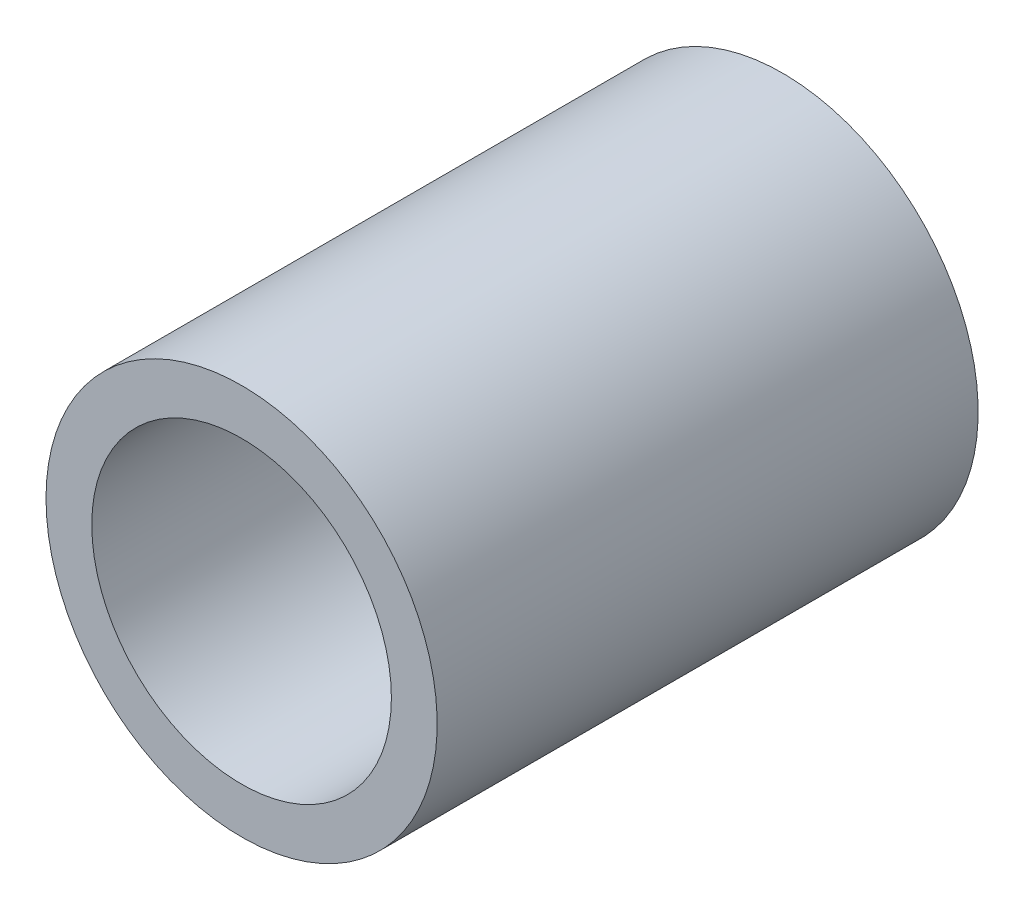
ISO-10303-21;
HEADER;
FILE_DESCRIPTION(('STEP AP214'),'2;1');
FILE_NAME('part.step','',(''),(''),'','','');
FILE_SCHEMA(('AUTOMOTIVE_DESIGN { 1 0 10303 214 1 1 1 1 }'));
ENDSEC;
DATA;
#1=APPLICATION_CONTEXT('core data for automotive mechanical design processes');
#2=APPLICATION_PROTOCOL_DEFINITION('international standard','automotive_design',2000,#1);
#3=PRODUCT_CONTEXT('',#1,'mechanical');
#4=PRODUCT('Part','Part','',(#3));
#5=PRODUCT_RELATED_PRODUCT_CATEGORY('part','',(#4));
#6=PRODUCT_DEFINITION_FORMATION('','',#4);
#7=PRODUCT_DEFINITION_CONTEXT('part definition',#1,'design');
#8=PRODUCT_DEFINITION('design','',#6,#7);
#9=PRODUCT_DEFINITION_SHAPE('','',#8);
#10=(LENGTH_UNIT() NAMED_UNIT(*) SI_UNIT(.MILLI.,.METRE.));
#11=(NAMED_UNIT(*) PLANE_ANGLE_UNIT() SI_UNIT($,.RADIAN.));
#12=(NAMED_UNIT(*) SI_UNIT($,.STERADIAN.) SOLID_ANGLE_UNIT());
#13=UNCERTAINTY_MEASURE_WITH_UNIT(LENGTH_MEASURE(1.E-05),#10,'distance_accuracy_value','');
#14=(GEOMETRIC_REPRESENTATION_CONTEXT(3) GLOBAL_UNCERTAINTY_ASSIGNED_CONTEXT((#13)) GLOBAL_UNIT_ASSIGNED_CONTEXT((#10,
#11,#12)) REPRESENTATION_CONTEXT('',''));
#15=CARTESIAN_POINT('',(0.,0.,0.));
#16=DIRECTION('',(0.,0.,1.));
#17=DIRECTION('',(1.,0.,0.));
#18=AXIS2_PLACEMENT_3D('',#15,#16,#17);
#19=CARTESIAN_POINT('',(0.,0.,13.));
#20=DIRECTION('',(0.,0.,1.));
#21=DIRECTION('',(1.,0.,0.));
#22=AXIS2_PLACEMENT_3D('',#19,#20,#21);
#23=PLANE('',#22);
#24=CARTESIAN_POINT('',(0.,0.,13.));
#25=DIRECTION('',(0.,0.,1.));
#26=DIRECTION('',(1.,0.,0.));
#27=AXIS2_PLACEMENT_3D('',#24,#25,#26);
#28=CIRCLE('',#27,4.7);
#29=CARTESIAN_POINT('',(-4.7,0.,13.));
#30=VERTEX_POINT('',#29);
#31=EDGE_CURVE('E10',#30,#30,#28,.T.);
#32=ORIENTED_EDGE('',*,*,#31,.T.);
#33=EDGE_LOOP('',(#32));
#34=FACE_BOUND('',#33,.T.);
#35=CARTESIAN_POINT('',(0.,0.,13.));
#36=DIRECTION('',(0.,0.,1.));
#37=DIRECTION('',(1.,0.,0.));
#38=AXIS2_PLACEMENT_3D('',#35,#36,#37);
#39=CIRCLE('',#38,3.6);
#40=CARTESIAN_POINT('',(-3.6,0.,13.));
#41=VERTEX_POINT('',#40);
#42=EDGE_CURVE('E50',#41,#41,#39,.T.);
#43=ORIENTED_EDGE('',*,*,#42,.F.);
#44=EDGE_LOOP('',(#43));
#45=FACE_BOUND('',#44,.T.);
#46=ADVANCED_FACE('F37',(#34,#45),#23,.T.);
#47=CARTESIAN_POINT('',(0.,0.,0.));
#48=DIRECTION('',(0.,0.,1.));
#49=DIRECTION('',(1.,0.,0.));
#50=AXIS2_PLACEMENT_3D('',#47,#48,#49);
#51=PLANE('',#50);
#52=CARTESIAN_POINT('',(0.,0.,0.));
#53=DIRECTION('',(0.,0.,1.));
#54=DIRECTION('',(1.,0.,0.));
#55=AXIS2_PLACEMENT_3D('',#52,#53,#54);
#56=CIRCLE('',#55,4.7);
#57=CARTESIAN_POINT('',(-4.7,0.,0.));
#58=VERTEX_POINT('',#57);
#59=EDGE_CURVE('E41',#58,#58,#56,.T.);
#60=ORIENTED_EDGE('',*,*,#59,.F.);
#61=EDGE_LOOP('',(#60));
#62=FACE_BOUND('',#61,.T.);
#63=CARTESIAN_POINT('',(0.,0.,0.));
#64=DIRECTION('',(0.,0.,1.));
#65=DIRECTION('',(1.,0.,0.));
#66=AXIS2_PLACEMENT_3D('',#63,#64,#65);
#67=CIRCLE('',#66,3.6);
#68=CARTESIAN_POINT('',(-3.6,0.,0.));
#69=VERTEX_POINT('',#68);
#70=EDGE_CURVE('E52',#69,#69,#67,.T.);
#71=ORIENTED_EDGE('',*,*,#70,.T.);
#72=EDGE_LOOP('',(#71));
#73=FACE_BOUND('',#72,.T.);
#74=ADVANCED_FACE('F64',(#62,#73),#51,.F.);
#75=CARTESIAN_POINT('',(0.,0.,13.));
#76=DIRECTION('',(0.,0.,-1.));
#77=DIRECTION('',(-1.,0.,0.));
#78=AXIS2_PLACEMENT_3D('',#75,#76,#77);
#79=CYLINDRICAL_SURFACE('',#78,4.7);
#80=CARTESIAN_POINT('',(-4.7,0.,13.));
#81=CARTESIAN_POINT('',(-4.7,0.,12.8645833333333));
#82=CARTESIAN_POINT('',(-4.7,0.,12.7291666666667));
#83=CARTESIAN_POINT('',(-4.7,0.,12.4583333333333));
#84=CARTESIAN_POINT('',(-4.7,0.,12.3229166666667));
#85=CARTESIAN_POINT('',(-4.7,0.,12.0520833333333));
#86=CARTESIAN_POINT('',(-4.7,0.,11.9166666666667));
#87=CARTESIAN_POINT('',(-4.7,0.,11.6458333333333));
#88=CARTESIAN_POINT('',(-4.7,0.,11.5104166666667));
#89=CARTESIAN_POINT('',(-4.7,0.,11.2395833333333));
#90=CARTESIAN_POINT('',(-4.7,0.,11.1041666666667));
#91=CARTESIAN_POINT('',(-4.7,0.,10.8333333333333));
#92=CARTESIAN_POINT('',(-4.7,0.,10.6979166666667));
#93=CARTESIAN_POINT('',(-4.7,0.,10.4270833333333));
#94=CARTESIAN_POINT('',(-4.7,0.,10.2916666666667));
#95=CARTESIAN_POINT('',(-4.7,0.,10.0208333333333));
#96=CARTESIAN_POINT('',(-4.7,0.,9.88541666666667));
#97=CARTESIAN_POINT('',(-4.7,0.,9.61458333333333));
#98=CARTESIAN_POINT('',(-4.7,0.,9.47916666666667));
#99=CARTESIAN_POINT('',(-4.7,0.,9.20833333333333));
#100=CARTESIAN_POINT('',(-4.7,0.,9.07291666666666));
#101=CARTESIAN_POINT('',(-4.7,0.,8.80208333333333));
#102=CARTESIAN_POINT('',(-4.7,0.,8.66666666666667));
#103=CARTESIAN_POINT('',(-4.7,0.,8.39583333333333));
#104=CARTESIAN_POINT('',(-4.7,0.,8.26041666666667));
#105=CARTESIAN_POINT('',(-4.7,0.,7.98958333333333));
#106=CARTESIAN_POINT('',(-4.7,0.,7.85416666666667));
#107=CARTESIAN_POINT('',(-4.7,0.,7.58333333333333));
#108=CARTESIAN_POINT('',(-4.7,0.,7.44791666666667));
#109=CARTESIAN_POINT('',(-4.7,0.,7.17708333333333));
#110=CARTESIAN_POINT('',(-4.7,0.,7.04166666666667));
#111=CARTESIAN_POINT('',(-4.7,0.,6.77083333333333));
#112=CARTESIAN_POINT('',(-4.7,0.,6.63541666666667));
#113=CARTESIAN_POINT('',(-4.7,0.,6.36458333333333));
#114=CARTESIAN_POINT('',(-4.7,0.,6.22916666666667));
#115=CARTESIAN_POINT('',(-4.7,0.,5.95833333333333));
#116=CARTESIAN_POINT('',(-4.7,0.,5.82291666666667));
#117=CARTESIAN_POINT('',(-4.7,0.,5.55208333333333));
#118=CARTESIAN_POINT('',(-4.7,0.,5.41666666666667));
#119=CARTESIAN_POINT('',(-4.7,0.,5.14583333333333));
#120=CARTESIAN_POINT('',(-4.7,0.,5.01041666666667));
#121=CARTESIAN_POINT('',(-4.7,0.,4.73958333333333));
#122=CARTESIAN_POINT('',(-4.7,0.,4.60416666666667));
#123=CARTESIAN_POINT('',(-4.7,0.,4.33333333333333));
#124=CARTESIAN_POINT('',(-4.7,0.,4.19791666666667));
#125=CARTESIAN_POINT('',(-4.7,0.,3.92708333333333));
#126=CARTESIAN_POINT('',(-4.7,0.,3.79166666666667));
#127=CARTESIAN_POINT('',(-4.7,0.,3.52083333333333));
#128=CARTESIAN_POINT('',(-4.7,0.,3.38541666666667));
#129=CARTESIAN_POINT('',(-4.7,0.,3.11458333333333));
#130=CARTESIAN_POINT('',(-4.7,0.,2.97916666666667));
#131=CARTESIAN_POINT('',(-4.7,0.,2.70833333333333));
#132=CARTESIAN_POINT('',(-4.7,0.,2.57291666666667));
#133=CARTESIAN_POINT('',(-4.7,0.,2.30208333333333));
#134=CARTESIAN_POINT('',(-4.7,0.,2.16666666666667));
#135=CARTESIAN_POINT('',(-4.7,0.,1.89583333333333));
#136=CARTESIAN_POINT('',(-4.7,0.,1.76041666666667));
#137=CARTESIAN_POINT('',(-4.7,0.,1.48958333333333));
#138=CARTESIAN_POINT('',(-4.7,0.,1.35416666666667));
#139=CARTESIAN_POINT('',(-4.7,0.,1.08333333333333));
#140=CARTESIAN_POINT('',(-4.7,0.,0.947916666666667));
#141=CARTESIAN_POINT('',(-4.7,0.,0.677083333333334));
#142=CARTESIAN_POINT('',(-4.7,0.,0.541666666666667));
#143=CARTESIAN_POINT('',(-4.7,0.,0.270833333333334));
#144=CARTESIAN_POINT('',(-4.7,0.,0.135416666666667));
#145=CARTESIAN_POINT('',(-4.7,0.,0.));
#146=B_SPLINE_CURVE_WITH_KNOTS('',3,(#80,#81,#82,#83,#84,#85,#86,#87,#88,#89,#90,#91,#92,#93,
#94,#95,#96,#97,#98,#99,#100,#101,#102,#103,#104,#105,#106,#107,#108,#109,#110,#111,#112,#113,
#114,#115,#116,#117,#118,#119,#120,#121,#122,#123,#124,#125,#126,#127,#128,#129,#130,#131,#132,
#133,#134,#135,#136,#137,#138,#139,#140,#141,#142,#143,#144,#145),.UNSPECIFIED.,.F.,.F.,(4,2,2,
2,2,2,2,2,2,2,2,2,2,2,2,2,2,2,2,2,2,2,2,2,2,2,2,2,2,2,2,2,4),(0.,0.40625,0.812500000000001,
1.21875,1.625,2.03125,2.4375,2.84375,3.25,3.65625,4.0625,4.46875,4.875,5.28125,5.6875,6.09375,
6.5,6.90625,7.3125,7.71875,8.125,8.53125,8.9375,9.34375,9.75,10.15625,10.5625,10.96875,11.375,
11.78125,12.1875,12.59375,13.),.UNSPECIFIED.);
#147=EDGE_CURVE('BSEAM39',#30,#58,#146,.T.);
#148=ORIENTED_EDGE('',*,*,#31,.F.);
#149=ORIENTED_EDGE('',*,*,#59,.T.);
#150=ORIENTED_EDGE('',*,*,#147,.T.);
#151=ORIENTED_EDGE('',*,*,#147,.F.);
#152=EDGE_LOOP('',(#148,#150,#149,#151));
#153=FACE_BOUND('',#152,.T.);
#154=ADVANCED_FACE('F39',(#153),#79,.T.);
#155=CARTESIAN_POINT('',(0.,0.,13.));
#156=DIRECTION('',(0.,0.,-1.));
#157=DIRECTION('',(-1.,0.,0.));
#158=AXIS2_PLACEMENT_3D('',#155,#156,#157);
#159=CYLINDRICAL_SURFACE('',#158,3.6);
#160=CARTESIAN_POINT('',(-3.6,0.,13.));
#161=CARTESIAN_POINT('',(-3.6,0.,12.8645833333333));
#162=CARTESIAN_POINT('',(-3.6,0.,12.7291666666667));
#163=CARTESIAN_POINT('',(-3.6,0.,12.4583333333333));
#164=CARTESIAN_POINT('',(-3.6,0.,12.3229166666667));
#165=CARTESIAN_POINT('',(-3.6,0.,12.0520833333333));
#166=CARTESIAN_POINT('',(-3.6,0.,11.9166666666667));
#167=CARTESIAN_POINT('',(-3.6,0.,11.6458333333333));
#168=CARTESIAN_POINT('',(-3.6,0.,11.5104166666667));
#169=CARTESIAN_POINT('',(-3.6,0.,11.2395833333333));
#170=CARTESIAN_POINT('',(-3.6,0.,11.1041666666667));
#171=CARTESIAN_POINT('',(-3.6,0.,10.8333333333333));
#172=CARTESIAN_POINT('',(-3.6,0.,10.6979166666667));
#173=CARTESIAN_POINT('',(-3.6,0.,10.4270833333333));
#174=CARTESIAN_POINT('',(-3.6,0.,10.2916666666667));
#175=CARTESIAN_POINT('',(-3.6,0.,10.0208333333333));
#176=CARTESIAN_POINT('',(-3.6,0.,9.88541666666667));
#177=CARTESIAN_POINT('',(-3.6,0.,9.61458333333333));
#178=CARTESIAN_POINT('',(-3.6,0.,9.47916666666667));
#179=CARTESIAN_POINT('',(-3.6,0.,9.20833333333333));
#180=CARTESIAN_POINT('',(-3.6,0.,9.07291666666667));
#181=CARTESIAN_POINT('',(-3.6,0.,8.80208333333333));
#182=CARTESIAN_POINT('',(-3.6,0.,8.66666666666667));
#183=CARTESIAN_POINT('',(-3.6,0.,8.39583333333333));
#184=CARTESIAN_POINT('',(-3.6,0.,8.26041666666667));
#185=CARTESIAN_POINT('',(-3.6,0.,7.98958333333333));
#186=CARTESIAN_POINT('',(-3.6,0.,7.85416666666667));
#187=CARTESIAN_POINT('',(-3.6,0.,7.58333333333333));
#188=CARTESIAN_POINT('',(-3.6,0.,7.44791666666667));
#189=CARTESIAN_POINT('',(-3.6,0.,7.17708333333333));
#190=CARTESIAN_POINT('',(-3.6,0.,7.04166666666667));
#191=CARTESIAN_POINT('',(-3.6,0.,6.77083333333333));
#192=CARTESIAN_POINT('',(-3.6,0.,6.63541666666667));
#193=CARTESIAN_POINT('',(-3.6,0.,6.36458333333333));
#194=CARTESIAN_POINT('',(-3.6,0.,6.22916666666667));
#195=CARTESIAN_POINT('',(-3.6,0.,5.95833333333333));
#196=CARTESIAN_POINT('',(-3.6,0.,5.82291666666667));
#197=CARTESIAN_POINT('',(-3.6,0.,5.55208333333333));
#198=CARTESIAN_POINT('',(-3.6,0.,5.41666666666667));
#199=CARTESIAN_POINT('',(-3.6,0.,5.14583333333333));
#200=CARTESIAN_POINT('',(-3.6,0.,5.01041666666667));
#201=CARTESIAN_POINT('',(-3.6,0.,4.73958333333333));
#202=CARTESIAN_POINT('',(-3.6,0.,4.60416666666667));
#203=CARTESIAN_POINT('',(-3.6,0.,4.33333333333333));
#204=CARTESIAN_POINT('',(-3.6,0.,4.19791666666667));
#205=CARTESIAN_POINT('',(-3.6,0.,3.92708333333333));
#206=CARTESIAN_POINT('',(-3.6,0.,3.79166666666667));
#207=CARTESIAN_POINT('',(-3.6,0.,3.52083333333333));
#208=CARTESIAN_POINT('',(-3.6,0.,3.38541666666667));
#209=CARTESIAN_POINT('',(-3.6,0.,3.11458333333333));
#210=CARTESIAN_POINT('',(-3.6,0.,2.97916666666667));
#211=CARTESIAN_POINT('',(-3.6,0.,2.70833333333333));
#212=CARTESIAN_POINT('',(-3.6,0.,2.57291666666667));
#213=CARTESIAN_POINT('',(-3.6,0.,2.30208333333333));
#214=CARTESIAN_POINT('',(-3.6,0.,2.16666666666667));
#215=CARTESIAN_POINT('',(-3.6,0.,1.89583333333333));
#216=CARTESIAN_POINT('',(-3.6,0.,1.76041666666667));
#217=CARTESIAN_POINT('',(-3.6,0.,1.48958333333333));
#218=CARTESIAN_POINT('',(-3.6,0.,1.35416666666667));
#219=CARTESIAN_POINT('',(-3.6,0.,1.08333333333333));
#220=CARTESIAN_POINT('',(-3.6,0.,0.947916666666667));
#221=CARTESIAN_POINT('',(-3.6,0.,0.677083333333334));
#222=CARTESIAN_POINT('',(-3.6,0.,0.541666666666667));
#223=CARTESIAN_POINT('',(-3.6,0.,0.270833333333334));
#224=CARTESIAN_POINT('',(-3.6,0.,0.135416666666667));
#225=CARTESIAN_POINT('',(-3.6,0.,0.));
#226=B_SPLINE_CURVE_WITH_KNOTS('',3,(#160,#161,#162,#163,#164,#165,#166,#167,#168,#169,#170,
#171,#172,#173,#174,#175,#176,#177,#178,#179,#180,#181,#182,#183,#184,#185,#186,#187,#188,#189,
#190,#191,#192,#193,#194,#195,#196,#197,#198,#199,#200,#201,#202,#203,#204,#205,#206,#207,#208,
#209,#210,#211,#212,#213,#214,#215,#216,#217,#218,#219,#220,#221,#222,#223,#224,#225),
.UNSPECIFIED.,.F.,.F.,(4,2,2,2,2,2,2,2,2,2,2,2,2,2,2,2,2,2,2,2,2,2,2,2,2,2,2,2,2,2,2,2,4),(0.,
0.406249999999999,0.812499999999999,1.21875,1.625,2.03125,2.4375,2.84375,3.25,3.65625,4.0625,
4.46875,4.875,5.28125,5.6875,6.09375,6.5,6.90625,7.3125,7.71875,8.125,8.53125,8.9375,9.34375,
9.75,10.15625,10.5625,10.96875,11.375,11.78125,12.1875,12.59375,13.),.UNSPECIFIED.);
#227=EDGE_CURVE('BSEAM60',#41,#69,#226,.T.);
#228=ORIENTED_EDGE('',*,*,#42,.T.);
#229=ORIENTED_EDGE('',*,*,#70,.F.);
#230=ORIENTED_EDGE('',*,*,#227,.T.);
#231=ORIENTED_EDGE('',*,*,#227,.F.);
#232=EDGE_LOOP('',(#228,#230,#229,#231));
#233=FACE_BOUND('',#232,.T.);
#234=ADVANCED_FACE('F60',(#233),#159,.F.);
#235=CLOSED_SHELL('',(#46,#74,#154,#234));
#236=MANIFOLD_SOLID_BREP('B2',#235);
#237=ADVANCED_BREP_SHAPE_REPRESENTATION('',(#18,#236),#14);
#238=SHAPE_DEFINITION_REPRESENTATION(#9,#237);
ENDSEC;
END-ISO-10303-21;
